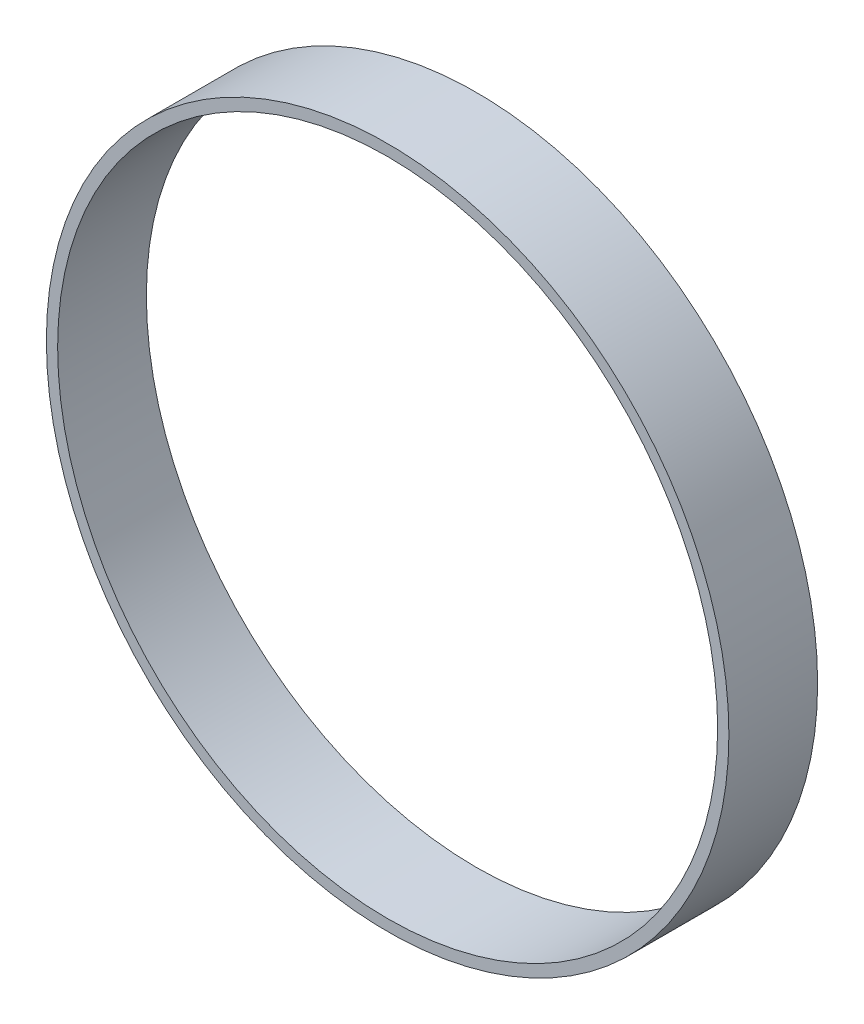
ISO-10303-21;
HEADER;
FILE_DESCRIPTION(('STEP AP214'),'2;1');
FILE_NAME('part.step','',(''),(''),'','','');
FILE_SCHEMA(('AUTOMOTIVE_DESIGN { 1 0 10303 214 1 1 1 1 }'));
ENDSEC;
DATA;
#1=APPLICATION_CONTEXT('core data for automotive mechanical design processes');
#2=APPLICATION_PROTOCOL_DEFINITION('international standard','automotive_design',2000,#1);
#3=PRODUCT_CONTEXT('',#1,'mechanical');
#4=PRODUCT('Part','Part','',(#3));
#5=PRODUCT_RELATED_PRODUCT_CATEGORY('part','',(#4));
#6=PRODUCT_DEFINITION_FORMATION('','',#4);
#7=PRODUCT_DEFINITION_CONTEXT('part definition',#1,'design');
#8=PRODUCT_DEFINITION('design','',#6,#7);
#9=PRODUCT_DEFINITION_SHAPE('','',#8);
#10=(LENGTH_UNIT() NAMED_UNIT(*) SI_UNIT(.MILLI.,.METRE.));
#11=(NAMED_UNIT(*) PLANE_ANGLE_UNIT() SI_UNIT($,.RADIAN.));
#12=(NAMED_UNIT(*) SI_UNIT($,.STERADIAN.) SOLID_ANGLE_UNIT());
#13=UNCERTAINTY_MEASURE_WITH_UNIT(LENGTH_MEASURE(1.E-05),#10,'distance_accuracy_value','');
#14=(GEOMETRIC_REPRESENTATION_CONTEXT(3) GLOBAL_UNCERTAINTY_ASSIGNED_CONTEXT((#13)) GLOBAL_UNIT_ASSIGNED_CONTEXT((#10,
#11,#12)) REPRESENTATION_CONTEXT('',''));
#15=CARTESIAN_POINT('',(0.,0.,0.));
#16=DIRECTION('',(0.,0.,1.));
#17=DIRECTION('',(1.,0.,0.));
#18=AXIS2_PLACEMENT_3D('',#15,#16,#17);
#19=CARTESIAN_POINT('',(0.,0.,-13.));
#20=DIRECTION('',(0.,0.,1.));
#21=DIRECTION('',(1.,0.,0.));
#22=AXIS2_PLACEMENT_3D('',#19,#20,#21);
#23=CYLINDRICAL_SURFACE('',#22,50.);
#24=CARTESIAN_POINT('',(0.,0.,-13.));
#25=DIRECTION('',(0.,0.,1.));
#26=DIRECTION('',(1.,0.,0.));
#27=AXIS2_PLACEMENT_3D('',#24,#25,#26);
#28=CIRCLE('',#27,50.);
#29=CARTESIAN_POINT('',(50.,0.,-13.));
#30=VERTEX_POINT('',#29);
#31=EDGE_CURVE('E10',#30,#30,#28,.T.);
#32=CARTESIAN_POINT('',(0.,0.,0.));
#33=DIRECTION('',(0.,0.,1.));
#34=DIRECTION('',(1.,0.,0.));
#35=AXIS2_PLACEMENT_3D('',#32,#33,#34);
#36=CIRCLE('',#35,50.);
#37=CARTESIAN_POINT('',(50.,0.,0.));
#38=VERTEX_POINT('',#37);
#39=EDGE_CURVE('E40',#38,#38,#36,.T.);
#40=CARTESIAN_POINT('',(50.,0.,-13.));
#41=CARTESIAN_POINT('',(50.,0.,-12.8645833333333));
#42=CARTESIAN_POINT('',(50.,0.,-12.7291666666667));
#43=CARTESIAN_POINT('',(50.,0.,-12.4583333333333));
#44=CARTESIAN_POINT('',(50.,0.,-12.3229166666667));
#45=CARTESIAN_POINT('',(50.,0.,-12.0520833333333));
#46=CARTESIAN_POINT('',(50.,0.,-11.9166666666667));
#47=CARTESIAN_POINT('',(50.,0.,-11.6458333333333));
#48=CARTESIAN_POINT('',(50.,0.,-11.5104166666667));
#49=CARTESIAN_POINT('',(50.,0.,-11.2395833333333));
#50=CARTESIAN_POINT('',(50.,0.,-11.1041666666667));
#51=CARTESIAN_POINT('',(50.,0.,-10.8333333333333));
#52=CARTESIAN_POINT('',(50.,0.,-10.6979166666667));
#53=CARTESIAN_POINT('',(50.,0.,-10.4270833333333));
#54=CARTESIAN_POINT('',(50.,0.,-10.2916666666667));
#55=CARTESIAN_POINT('',(50.,0.,-10.0208333333333));
#56=CARTESIAN_POINT('',(50.,0.,-9.88541666666667));
#57=CARTESIAN_POINT('',(50.,0.,-9.61458333333333));
#58=CARTESIAN_POINT('',(50.,0.,-9.47916666666667));
#59=CARTESIAN_POINT('',(50.,0.,-9.20833333333333));
#60=CARTESIAN_POINT('',(50.,0.,-9.07291666666667));
#61=CARTESIAN_POINT('',(50.,0.,-8.80208333333333));
#62=CARTESIAN_POINT('',(50.,0.,-8.66666666666667));
#63=CARTESIAN_POINT('',(50.,0.,-8.39583333333333));
#64=CARTESIAN_POINT('',(50.,0.,-8.26041666666667));
#65=CARTESIAN_POINT('',(50.,0.,-7.98958333333333));
#66=CARTESIAN_POINT('',(50.,0.,-7.85416666666667));
#67=CARTESIAN_POINT('',(50.,0.,-7.58333333333333));
#68=CARTESIAN_POINT('',(50.,0.,-7.44791666666667));
#69=CARTESIAN_POINT('',(50.,0.,-7.17708333333333));
#70=CARTESIAN_POINT('',(50.,0.,-7.04166666666667));
#71=CARTESIAN_POINT('',(50.,0.,-6.77083333333333));
#72=CARTESIAN_POINT('',(50.,0.,-6.63541666666667));
#73=CARTESIAN_POINT('',(50.,0.,-6.36458333333333));
#74=CARTESIAN_POINT('',(50.,0.,-6.22916666666667));
#75=CARTESIAN_POINT('',(50.,0.,-5.95833333333333));
#76=CARTESIAN_POINT('',(50.,0.,-5.82291666666667));
#77=CARTESIAN_POINT('',(50.,0.,-5.55208333333333));
#78=CARTESIAN_POINT('',(50.,0.,-5.41666666666667));
#79=CARTESIAN_POINT('',(50.,0.,-5.14583333333333));
#80=CARTESIAN_POINT('',(50.,0.,-5.01041666666667));
#81=CARTESIAN_POINT('',(50.,0.,-4.73958333333333));
#82=CARTESIAN_POINT('',(50.,0.,-4.60416666666667));
#83=CARTESIAN_POINT('',(50.,0.,-4.33333333333333));
#84=CARTESIAN_POINT('',(50.,0.,-4.19791666666667));
#85=CARTESIAN_POINT('',(50.,0.,-3.92708333333333));
#86=CARTESIAN_POINT('',(50.,0.,-3.79166666666667));
#87=CARTESIAN_POINT('',(50.,0.,-3.52083333333333));
#88=CARTESIAN_POINT('',(50.,0.,-3.38541666666667));
#89=CARTESIAN_POINT('',(50.,0.,-3.11458333333333));
#90=CARTESIAN_POINT('',(50.,0.,-2.97916666666667));
#91=CARTESIAN_POINT('',(50.,0.,-2.70833333333333));
#92=CARTESIAN_POINT('',(50.,0.,-2.57291666666667));
#93=CARTESIAN_POINT('',(50.,0.,-2.30208333333333));
#94=CARTESIAN_POINT('',(50.,0.,-2.16666666666667));
#95=CARTESIAN_POINT('',(50.,0.,-1.89583333333333));
#96=CARTESIAN_POINT('',(50.,0.,-1.76041666666667));
#97=CARTESIAN_POINT('',(50.,0.,-1.48958333333333));
#98=CARTESIAN_POINT('',(50.,0.,-1.35416666666667));
#99=CARTESIAN_POINT('',(50.,0.,-1.08333333333333));
#100=CARTESIAN_POINT('',(50.,0.,-0.947916666666667));
#101=CARTESIAN_POINT('',(50.,0.,-0.677083333333334));
#102=CARTESIAN_POINT('',(50.,0.,-0.541666666666667));
#103=CARTESIAN_POINT('',(50.,0.,-0.270833333333334));
#104=CARTESIAN_POINT('',(50.,0.,-0.135416666666667));
#105=CARTESIAN_POINT('',(50.,0.,0.));
#106=B_SPLINE_CURVE_WITH_KNOTS('',3,(#40,#41,#42,#43,#44,#45,#46,#47,#48,#49,#50,#51,#52,#53,
#54,#55,#56,#57,#58,#59,#60,#61,#62,#63,#64,#65,#66,#67,#68,#69,#70,#71,#72,#73,#74,#75,#76,#77,
#78,#79,#80,#81,#82,#83,#84,#85,#86,#87,#88,#89,#90,#91,#92,#93,#94,#95,#96,#97,#98,#99,#100,
#101,#102,#103,#104,#105),.UNSPECIFIED.,.F.,.F.,(4,2,2,2,2,2,2,2,2,2,2,2,2,2,2,2,2,2,2,2,2,2,2,
2,2,2,2,2,2,2,2,2,4),(0.,0.406249999999999,0.812499999999999,1.21875,1.625,2.03125,2.4375,
2.84375,3.25,3.65625,4.0625,4.46875,4.875,5.28125,5.6875,6.09375,6.5,6.90625,7.3125,7.71875,
8.125,8.53125,8.9375,9.34375,9.75,10.15625,10.5625,10.96875,11.375,11.78125,12.1875,12.59375,
13.),.UNSPECIFIED.);
#107=EDGE_CURVE('BSEAM37',#30,#38,#106,.T.);
#108=ORIENTED_EDGE('',*,*,#31,.T.);
#109=ORIENTED_EDGE('',*,*,#39,.F.);
#110=ORIENTED_EDGE('',*,*,#107,.T.);
#111=ORIENTED_EDGE('',*,*,#107,.F.);
#112=EDGE_LOOP('',(#108,#110,#109,#111));
#113=FACE_BOUND('',#112,.T.);
#114=ADVANCED_FACE('F37',(#113),#23,.T.);
#115=CARTESIAN_POINT('',(0.,0.,-13.));
#116=DIRECTION('',(0.,0.,1.));
#117=DIRECTION('',(1.,0.,0.));
#118=AXIS2_PLACEMENT_3D('',#115,#116,#117);
#119=PLANE('',#118);
#120=CARTESIAN_POINT('',(0.,0.,-13.));
#121=DIRECTION('',(0.,0.,1.));
#122=DIRECTION('',(1.,0.,0.));
#123=AXIS2_PLACEMENT_3D('',#120,#121,#122);
#124=CIRCLE('',#123,48.35);
#125=CARTESIAN_POINT('',(48.35,0.,-13.));
#126=VERTEX_POINT('',#125);
#127=EDGE_CURVE('E47',#126,#126,#124,.T.);
#128=ORIENTED_EDGE('',*,*,#127,.T.);
#129=EDGE_LOOP('',(#128));
#130=FACE_BOUND('',#129,.T.);
#131=ORIENTED_EDGE('',*,*,#31,.F.);
#132=EDGE_LOOP('',(#131));
#133=FACE_BOUND('',#132,.T.);
#134=ADVANCED_FACE('F55',(#130,#133),#119,.F.);
#135=CARTESIAN_POINT('',(0.,0.,0.));
#136=DIRECTION('',(0.,0.,1.));
#137=DIRECTION('',(1.,0.,0.));
#138=AXIS2_PLACEMENT_3D('',#135,#136,#137);
#139=PLANE('',#138);
#140=CARTESIAN_POINT('',(0.,0.,0.));
#141=DIRECTION('',(0.,0.,1.));
#142=DIRECTION('',(1.,0.,0.));
#143=AXIS2_PLACEMENT_3D('',#140,#141,#142);
#144=CIRCLE('',#143,48.35);
#145=CARTESIAN_POINT('',(48.35,0.,0.));
#146=VERTEX_POINT('',#145);
#147=EDGE_CURVE('E49',#146,#146,#144,.T.);
#148=ORIENTED_EDGE('',*,*,#147,.F.);
#149=EDGE_LOOP('',(#148));
#150=FACE_BOUND('',#149,.T.);
#151=ORIENTED_EDGE('',*,*,#39,.T.);
#152=EDGE_LOOP('',(#151));
#153=FACE_BOUND('',#152,.T.);
#154=ADVANCED_FACE('F61',(#150,#153),#139,.T.);
#155=CARTESIAN_POINT('',(0.,0.,-13.));
#156=DIRECTION('',(0.,0.,1.));
#157=DIRECTION('',(1.,0.,0.));
#158=AXIS2_PLACEMENT_3D('',#155,#156,#157);
#159=CYLINDRICAL_SURFACE('',#158,48.35);
#160=CARTESIAN_POINT('',(48.35,0.,-13.));
#161=CARTESIAN_POINT('',(48.35,0.,-12.8645833333333));
#162=CARTESIAN_POINT('',(48.35,0.,-12.7291666666667));
#163=CARTESIAN_POINT('',(48.35,0.,-12.4583333333333));
#164=CARTESIAN_POINT('',(48.35,0.,-12.3229166666667));
#165=CARTESIAN_POINT('',(48.35,0.,-12.0520833333333));
#166=CARTESIAN_POINT('',(48.35,0.,-11.9166666666667));
#167=CARTESIAN_POINT('',(48.35,0.,-11.6458333333333));
#168=CARTESIAN_POINT('',(48.35,0.,-11.5104166666667));
#169=CARTESIAN_POINT('',(48.35,0.,-11.2395833333333));
#170=CARTESIAN_POINT('',(48.35,0.,-11.1041666666667));
#171=CARTESIAN_POINT('',(48.35,0.,-10.8333333333333));
#172=CARTESIAN_POINT('',(48.35,0.,-10.6979166666667));
#173=CARTESIAN_POINT('',(48.35,0.,-10.4270833333333));
#174=CARTESIAN_POINT('',(48.35,0.,-10.2916666666667));
#175=CARTESIAN_POINT('',(48.35,0.,-10.0208333333333));
#176=CARTESIAN_POINT('',(48.35,0.,-9.88541666666667));
#177=CARTESIAN_POINT('',(48.35,0.,-9.61458333333333));
#178=CARTESIAN_POINT('',(48.35,0.,-9.47916666666667));
#179=CARTESIAN_POINT('',(48.35,0.,-9.20833333333333));
#180=CARTESIAN_POINT('',(48.35,0.,-9.07291666666667));
#181=CARTESIAN_POINT('',(48.35,0.,-8.80208333333333));
#182=CARTESIAN_POINT('',(48.35,0.,-8.66666666666667));
#183=CARTESIAN_POINT('',(48.35,0.,-8.39583333333333));
#184=CARTESIAN_POINT('',(48.35,0.,-8.26041666666667));
#185=CARTESIAN_POINT('',(48.35,0.,-7.98958333333333));
#186=CARTESIAN_POINT('',(48.35,0.,-7.85416666666667));
#187=CARTESIAN_POINT('',(48.35,0.,-7.58333333333333));
#188=CARTESIAN_POINT('',(48.35,0.,-7.44791666666667));
#189=CARTESIAN_POINT('',(48.35,0.,-7.17708333333333));
#190=CARTESIAN_POINT('',(48.35,0.,-7.04166666666667));
#191=CARTESIAN_POINT('',(48.35,0.,-6.77083333333333));
#192=CARTESIAN_POINT('',(48.35,0.,-6.63541666666667));
#193=CARTESIAN_POINT('',(48.35,0.,-6.36458333333333));
#194=CARTESIAN_POINT('',(48.35,0.,-6.22916666666667));
#195=CARTESIAN_POINT('',(48.35,0.,-5.95833333333333));
#196=CARTESIAN_POINT('',(48.35,0.,-5.82291666666667));
#197=CARTESIAN_POINT('',(48.35,0.,-5.55208333333333));
#198=CARTESIAN_POINT('',(48.35,0.,-5.41666666666667));
#199=CARTESIAN_POINT('',(48.35,0.,-5.14583333333333));
#200=CARTESIAN_POINT('',(48.35,0.,-5.01041666666667));
#201=CARTESIAN_POINT('',(48.35,0.,-4.73958333333333));
#202=CARTESIAN_POINT('',(48.35,0.,-4.60416666666667));
#203=CARTESIAN_POINT('',(48.35,0.,-4.33333333333333));
#204=CARTESIAN_POINT('',(48.35,0.,-4.19791666666667));
#205=CARTESIAN_POINT('',(48.35,0.,-3.92708333333333));
#206=CARTESIAN_POINT('',(48.35,0.,-3.79166666666667));
#207=CARTESIAN_POINT('',(48.35,0.,-3.52083333333333));
#208=CARTESIAN_POINT('',(48.35,0.,-3.38541666666667));
#209=CARTESIAN_POINT('',(48.35,0.,-3.11458333333333));
#210=CARTESIAN_POINT('',(48.35,0.,-2.97916666666667));
#211=CARTESIAN_POINT('',(48.35,0.,-2.70833333333333));
#212=CARTESIAN_POINT('',(48.35,0.,-2.57291666666667));
#213=CARTESIAN_POINT('',(48.35,0.,-2.30208333333333));
#214=CARTESIAN_POINT('',(48.35,0.,-2.16666666666667));
#215=CARTESIAN_POINT('',(48.35,0.,-1.89583333333333));
#216=CARTESIAN_POINT('',(48.35,0.,-1.76041666666667));
#217=CARTESIAN_POINT('',(48.35,0.,-1.48958333333333));
#218=CARTESIAN_POINT('',(48.35,0.,-1.35416666666667));
#219=CARTESIAN_POINT('',(48.35,0.,-1.08333333333333));
#220=CARTESIAN_POINT('',(48.35,0.,-0.947916666666667));
#221=CARTESIAN_POINT('',(48.35,0.,-0.677083333333334));
#222=CARTESIAN_POINT('',(48.35,0.,-0.541666666666667));
#223=CARTESIAN_POINT('',(48.35,0.,-0.270833333333334));
#224=CARTESIAN_POINT('',(48.35,0.,-0.135416666666667));
#225=CARTESIAN_POINT('',(48.35,0.,0.));
#226=B_SPLINE_CURVE_WITH_KNOTS('',3,(#160,#161,#162,#163,#164,#165,#166,#167,#168,#169,#170,
#171,#172,#173,#174,#175,#176,#177,#178,#179,#180,#181,#182,#183,#184,#185,#186,#187,#188,#189,
#190,#191,#192,#193,#194,#195,#196,#197,#198,#199,#200,#201,#202,#203,#204,#205,#206,#207,#208,
#209,#210,#211,#212,#213,#214,#215,#216,#217,#218,#219,#220,#221,#222,#223,#224,#225),
.UNSPECIFIED.,.F.,.F.,(4,2,2,2,2,2,2,2,2,2,2,2,2,2,2,2,2,2,2,2,2,2,2,2,2,2,2,2,2,2,2,2,4),(0.,
0.40625,0.812500000000001,1.21875,1.625,2.03125,2.4375,2.84375,3.25,3.65625,4.0625,4.46875,
4.875,5.28125,5.6875,6.09375,6.5,6.90625,7.3125,7.71875,8.125,8.53125,8.9375,9.34375,9.75,
10.15625,10.5625,10.96875,11.375,11.78125,12.1875,12.59375,13.),.UNSPECIFIED.);
#227=EDGE_CURVE('BSEAM58',#126,#146,#226,.T.);
#228=ORIENTED_EDGE('',*,*,#127,.F.);
#229=ORIENTED_EDGE('',*,*,#147,.T.);
#230=ORIENTED_EDGE('',*,*,#227,.T.);
#231=ORIENTED_EDGE('',*,*,#227,.F.);
#232=EDGE_LOOP('',(#228,#230,#229,#231));
#233=FACE_BOUND('',#232,.T.);
#234=ADVANCED_FACE('F58',(#233),#159,.F.);
#235=CLOSED_SHELL('',(#114,#134,#154,#234));
#236=MANIFOLD_SOLID_BREP('B2',#235);
#237=ADVANCED_BREP_SHAPE_REPRESENTATION('',(#18,#236),#14);
#238=SHAPE_DEFINITION_REPRESENTATION(#9,#237);
ENDSEC;
END-ISO-10303-21;
